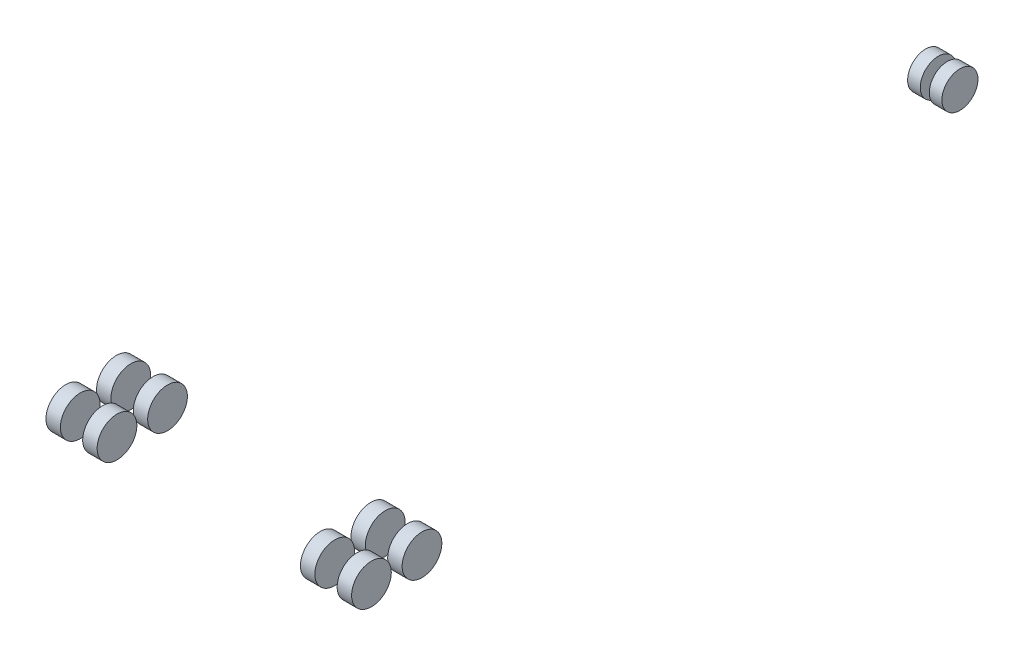
ISO-10303-21;
HEADER;
FILE_DESCRIPTION(('STEP AP214'),'2;1');
FILE_NAME('part.step','',(''),(''),'','','');
FILE_SCHEMA(('AUTOMOTIVE_DESIGN { 1 0 10303 214 1 1 1 1 }'));
ENDSEC;
DATA;
#1=APPLICATION_CONTEXT('core data for automotive mechanical design processes');
#2=APPLICATION_PROTOCOL_DEFINITION('international standard','automotive_design',2000,#1);
#3=PRODUCT_CONTEXT('',#1,'mechanical');
#4=PRODUCT('Part','Part','',(#3));
#5=PRODUCT_RELATED_PRODUCT_CATEGORY('part','',(#4));
#6=PRODUCT_DEFINITION_FORMATION('','',#4);
#7=PRODUCT_DEFINITION_CONTEXT('part definition',#1,'design');
#8=PRODUCT_DEFINITION('design','',#6,#7);
#9=PRODUCT_DEFINITION_SHAPE('','',#8);
#10=(LENGTH_UNIT() NAMED_UNIT(*) SI_UNIT(.MILLI.,.METRE.));
#11=(NAMED_UNIT(*) PLANE_ANGLE_UNIT() SI_UNIT($,.RADIAN.));
#12=(NAMED_UNIT(*) SI_UNIT($,.STERADIAN.) SOLID_ANGLE_UNIT());
#13=UNCERTAINTY_MEASURE_WITH_UNIT(LENGTH_MEASURE(1.E-05),#10,'distance_accuracy_value','');
#14=(GEOMETRIC_REPRESENTATION_CONTEXT(3) GLOBAL_UNCERTAINTY_ASSIGNED_CONTEXT((#13)) GLOBAL_UNIT_ASSIGNED_CONTEXT((#10,
#11,#12)) REPRESENTATION_CONTEXT('',''));
#15=CARTESIAN_POINT('',(0.,0.,0.));
#16=DIRECTION('',(0.,0.,1.));
#17=DIRECTION('',(1.,0.,0.));
#18=AXIS2_PLACEMENT_3D('',#15,#16,#17);
#19=CARTESIAN_POINT('',(127.,508.,-17678.4));
#20=DIRECTION('',(1.,0.,0.));
#21=DIRECTION('',(0.,0.,-1.));
#22=AXIS2_PLACEMENT_3D('',#19,#20,#21);
#23=CYLINDRICAL_SURFACE('',#22,507.999999999999);
#24=CARTESIAN_POINT('',(127.,508.,-17678.4));
#25=DIRECTION('',(1.,0.,0.));
#26=DIRECTION('',(0.,0.,-1.));
#27=AXIS2_PLACEMENT_3D('',#24,#25,#26);
#28=CIRCLE('',#27,507.999999999999);
#29=CARTESIAN_POINT('',(127.,508.,-18186.4));
#30=VERTEX_POINT('',#29);
#31=EDGE_CURVE('E11',#30,#30,#28,.T.);
#32=CARTESIAN_POINT('',(482.6,508.,-17678.4));
#33=DIRECTION('',(1.,0.,0.));
#34=DIRECTION('',(0.,0.,-1.));
#35=AXIS2_PLACEMENT_3D('',#32,#33,#34);
#36=CIRCLE('',#35,507.999999999999);
#37=CARTESIAN_POINT('',(482.6,508.,-18186.4));
#38=VERTEX_POINT('',#37);
#39=EDGE_CURVE('E57',#38,#38,#36,.T.);
#40=CARTESIAN_POINT('',(127.,508.,-18186.4));
#41=CARTESIAN_POINT('',(130.704166666667,508.,-18186.4));
#42=CARTESIAN_POINT('',(134.408333333334,508.,-18186.4));
#43=CARTESIAN_POINT('',(141.816666666667,508.,-18186.4));
#44=CARTESIAN_POINT('',(145.520833333334,508.,-18186.4));
#45=CARTESIAN_POINT('',(152.929166666667,508.,-18186.4));
#46=CARTESIAN_POINT('',(156.633333333334,508.,-18186.4));
#47=CARTESIAN_POINT('',(164.041666666667,508.,-18186.4));
#48=CARTESIAN_POINT('',(167.745833333334,508.,-18186.4));
#49=CARTESIAN_POINT('',(175.154166666667,508.,-18186.4));
#50=CARTESIAN_POINT('',(178.858333333334,508.,-18186.4));
#51=CARTESIAN_POINT('',(186.266666666667,508.,-18186.4));
#52=CARTESIAN_POINT('',(189.970833333334,508.,-18186.4));
#53=CARTESIAN_POINT('',(197.379166666667,508.,-18186.4));
#54=CARTESIAN_POINT('',(201.083333333334,508.,-18186.4));
#55=CARTESIAN_POINT('',(208.491666666667,508.,-18186.4));
#56=CARTESIAN_POINT('',(212.195833333333,508.,-18186.4));
#57=CARTESIAN_POINT('',(219.604166666667,508.,-18186.4));
#58=CARTESIAN_POINT('',(223.308333333334,508.,-18186.4));
#59=CARTESIAN_POINT('',(230.716666666667,508.,-18186.4));
#60=CARTESIAN_POINT('',(234.420833333333,508.,-18186.4));
#61=CARTESIAN_POINT('',(241.829166666667,508.,-18186.4));
#62=CARTESIAN_POINT('',(245.533333333334,508.,-18186.4));
#63=CARTESIAN_POINT('',(252.941666666667,508.,-18186.4));
#64=CARTESIAN_POINT('',(256.645833333334,508.,-18186.4));
#65=CARTESIAN_POINT('',(264.054166666667,508.,-18186.4));
#66=CARTESIAN_POINT('',(267.758333333333,508.,-18186.4));
#67=CARTESIAN_POINT('',(275.166666666667,508.,-18186.4));
#68=CARTESIAN_POINT('',(278.870833333333,508.,-18186.4));
#69=CARTESIAN_POINT('',(286.279166666667,508.,-18186.4));
#70=CARTESIAN_POINT('',(289.983333333333,508.,-18186.4));
#71=CARTESIAN_POINT('',(297.391666666667,508.,-18186.4));
#72=CARTESIAN_POINT('',(301.095833333334,508.,-18186.4));
#73=CARTESIAN_POINT('',(308.504166666667,508.,-18186.4));
#74=CARTESIAN_POINT('',(312.208333333333,508.,-18186.4));
#75=CARTESIAN_POINT('',(319.616666666667,508.,-18186.4));
#76=CARTESIAN_POINT('',(323.320833333333,508.,-18186.4));
#77=CARTESIAN_POINT('',(330.729166666667,508.,-18186.4));
#78=CARTESIAN_POINT('',(334.433333333333,508.,-18186.4));
#79=CARTESIAN_POINT('',(341.841666666667,508.,-18186.4));
#80=CARTESIAN_POINT('',(345.545833333334,508.,-18186.4));
#81=CARTESIAN_POINT('',(352.954166666667,508.,-18186.4));
#82=CARTESIAN_POINT('',(356.658333333333,508.,-18186.4));
#83=CARTESIAN_POINT('',(364.066666666667,508.,-18186.4));
#84=CARTESIAN_POINT('',(367.770833333333,508.,-18186.4));
#85=CARTESIAN_POINT('',(375.179166666667,508.,-18186.4));
#86=CARTESIAN_POINT('',(378.883333333333,508.,-18186.4));
#87=CARTESIAN_POINT('',(386.291666666667,508.,-18186.4));
#88=CARTESIAN_POINT('',(389.995833333333,508.,-18186.4));
#89=CARTESIAN_POINT('',(397.404166666667,508.,-18186.4));
#90=CARTESIAN_POINT('',(401.108333333333,508.,-18186.4));
#91=CARTESIAN_POINT('',(408.516666666667,508.,-18186.4));
#92=CARTESIAN_POINT('',(412.220833333333,508.,-18186.4));
#93=CARTESIAN_POINT('',(419.629166666667,508.,-18186.4));
#94=CARTESIAN_POINT('',(423.333333333333,508.,-18186.4));
#95=CARTESIAN_POINT('',(430.741666666667,508.,-18186.4));
#96=CARTESIAN_POINT('',(434.445833333333,508.,-18186.4));
#97=CARTESIAN_POINT('',(441.854166666667,508.,-18186.4));
#98=CARTESIAN_POINT('',(445.558333333333,508.,-18186.4));
#99=CARTESIAN_POINT('',(452.966666666667,508.,-18186.4));
#100=CARTESIAN_POINT('',(456.670833333333,508.,-18186.4));
#101=CARTESIAN_POINT('',(464.079166666667,508.,-18186.4));
#102=CARTESIAN_POINT('',(467.783333333333,508.,-18186.4));
#103=CARTESIAN_POINT('',(475.191666666667,508.,-18186.4));
#104=CARTESIAN_POINT('',(478.895833333333,508.,-18186.4));
#105=CARTESIAN_POINT('',(482.6,508.,-18186.4));
#106=B_SPLINE_CURVE_WITH_KNOTS('',3,(#40,#41,#42,#43,#44,#45,#46,#47,#48,#49,#50,#51,#52,#53,
#54,#55,#56,#57,#58,#59,#60,#61,#62,#63,#64,#65,#66,#67,#68,#69,#70,#71,#72,#73,#74,#75,#76,#77,
#78,#79,#80,#81,#82,#83,#84,#85,#86,#87,#88,#89,#90,#91,#92,#93,#94,#95,#96,#97,#98,#99,#100,
#101,#102,#103,#104,#105),.UNSPECIFIED.,.F.,.F.,(4,2,2,2,2,2,2,2,2,2,2,2,2,2,2,2,2,2,2,2,2,2,2,
2,2,2,2,2,2,2,2,2,4),(0.,11.1125,22.225,33.3375,44.45,55.5625,66.675,77.7875,88.8999999999999,
100.0125,111.125,122.2375,133.35,144.4625,155.575,166.6875,177.8,188.9125,200.025,211.1375,
222.25,233.3625,244.475,255.5875,266.7,277.8125,288.925,300.0375,311.15,322.2625,333.375,
344.4875,355.6),.UNSPECIFIED.);
#107=EDGE_CURVE('BSEAM50',#30,#38,#106,.T.);
#108=ORIENTED_EDGE('',*,*,#31,.T.);
#109=ORIENTED_EDGE('',*,*,#39,.F.);
#110=ORIENTED_EDGE('',*,*,#107,.T.);
#111=ORIENTED_EDGE('',*,*,#107,.F.);
#112=EDGE_LOOP('',(#108,#110,#109,#111));
#113=FACE_BOUND('',#112,.T.);
#114=ADVANCED_FACE('F50',(#113),#23,.T.);
#115=CARTESIAN_POINT('',(127.,508.,-17678.4));
#116=DIRECTION('',(1.,0.,0.));
#117=DIRECTION('',(0.,0.,-1.));
#118=AXIS2_PLACEMENT_3D('',#115,#116,#117);
#119=PLANE('',#118);
#120=ORIENTED_EDGE('',*,*,#31,.F.);
#121=EDGE_LOOP('',(#120));
#122=FACE_BOUND('',#121,.T.);
#123=ADVANCED_FACE('F69',(#122),#119,.F.);
#124=CARTESIAN_POINT('',(482.6,508.,-17678.4));
#125=DIRECTION('',(1.,0.,0.));
#126=DIRECTION('',(0.,0.,-1.));
#127=AXIS2_PLACEMENT_3D('',#124,#125,#126);
#128=PLANE('',#127);
#129=ORIENTED_EDGE('',*,*,#39,.T.);
#130=EDGE_LOOP('',(#129));
#131=FACE_BOUND('',#130,.T.);
#132=ADVANCED_FACE('F66',(#131),#128,.T.);
#133=CLOSED_SHELL('',(#114,#123,#132));
#134=MANIFOLD_SOLID_BREP('B2',#133);
#135=CARTESIAN_POINT('',(-482.6,508.,-17678.4));
#136=DIRECTION('',(1.,0.,0.));
#137=DIRECTION('',(0.,0.,-1.));
#138=AXIS2_PLACEMENT_3D('',#135,#136,#137);
#139=CYLINDRICAL_SURFACE('',#138,507.999999999999);
#140=CARTESIAN_POINT('',(-482.6,508.,-17678.4));
#141=DIRECTION('',(1.,0.,0.));
#142=DIRECTION('',(0.,0.,-1.));
#143=AXIS2_PLACEMENT_3D('',#140,#141,#142);
#144=CIRCLE('',#143,507.999999999999);
#145=CARTESIAN_POINT('',(-482.6,508.,-18186.4));
#146=VERTEX_POINT('',#145);
#147=EDGE_CURVE('E49',#146,#146,#144,.T.);
#148=CARTESIAN_POINT('',(-127.,508.,-17678.4));
#149=DIRECTION('',(1.,0.,0.));
#150=DIRECTION('',(0.,0.,-1.));
#151=AXIS2_PLACEMENT_3D('',#148,#149,#150);
#152=CIRCLE('',#151,507.999999999999);
#153=CARTESIAN_POINT('',(-127.,508.,-18186.4));
#154=VERTEX_POINT('',#153);
#155=EDGE_CURVE('E110',#154,#154,#152,.T.);
#156=CARTESIAN_POINT('',(-482.6,508.,-18186.4));
#157=CARTESIAN_POINT('',(-478.895833333334,508.,-18186.4));
#158=CARTESIAN_POINT('',(-475.191666666667,508.,-18186.4));
#159=CARTESIAN_POINT('',(-467.783333333333,508.,-18186.4));
#160=CARTESIAN_POINT('',(-464.079166666667,508.,-18186.4));
#161=CARTESIAN_POINT('',(-456.670833333334,508.,-18186.4));
#162=CARTESIAN_POINT('',(-452.966666666667,508.,-18186.4));
#163=CARTESIAN_POINT('',(-445.558333333334,508.,-18186.4));
#164=CARTESIAN_POINT('',(-441.854166666667,508.,-18186.4));
#165=CARTESIAN_POINT('',(-434.445833333333,508.,-18186.4));
#166=CARTESIAN_POINT('',(-430.741666666667,508.,-18186.4));
#167=CARTESIAN_POINT('',(-423.333333333333,508.,-18186.4));
#168=CARTESIAN_POINT('',(-419.629166666667,508.,-18186.4));
#169=CARTESIAN_POINT('',(-412.220833333334,508.,-18186.4));
#170=CARTESIAN_POINT('',(-408.516666666667,508.,-18186.4));
#171=CARTESIAN_POINT('',(-401.108333333334,508.,-18186.4));
#172=CARTESIAN_POINT('',(-397.404166666667,508.,-18186.4));
#173=CARTESIAN_POINT('',(-389.995833333334,508.,-18186.4));
#174=CARTESIAN_POINT('',(-386.291666666667,508.,-18186.4));
#175=CARTESIAN_POINT('',(-378.883333333333,508.,-18186.4));
#176=CARTESIAN_POINT('',(-375.179166666667,508.,-18186.4));
#177=CARTESIAN_POINT('',(-367.770833333334,508.,-18186.4));
#178=CARTESIAN_POINT('',(-364.066666666667,508.,-18186.4));
#179=CARTESIAN_POINT('',(-356.658333333334,508.,-18186.4));
#180=CARTESIAN_POINT('',(-352.954166666667,508.,-18186.4));
#181=CARTESIAN_POINT('',(-345.545833333334,508.,-18186.4));
#182=CARTESIAN_POINT('',(-341.841666666667,508.,-18186.4));
#183=CARTESIAN_POINT('',(-334.433333333334,508.,-18186.4));
#184=CARTESIAN_POINT('',(-330.729166666667,508.,-18186.4));
#185=CARTESIAN_POINT('',(-323.320833333334,508.,-18186.4));
#186=CARTESIAN_POINT('',(-319.616666666667,508.,-18186.4));
#187=CARTESIAN_POINT('',(-312.208333333334,508.,-18186.4));
#188=CARTESIAN_POINT('',(-308.504166666667,508.,-18186.4));
#189=CARTESIAN_POINT('',(-301.095833333334,508.,-18186.4));
#190=CARTESIAN_POINT('',(-297.391666666667,508.,-18186.4));
#191=CARTESIAN_POINT('',(-289.983333333334,508.,-18186.4));
#192=CARTESIAN_POINT('',(-286.279166666667,508.,-18186.4));
#193=CARTESIAN_POINT('',(-278.870833333334,508.,-18186.4));
#194=CARTESIAN_POINT('',(-275.166666666667,508.,-18186.4));
#195=CARTESIAN_POINT('',(-267.758333333334,508.,-18186.4));
#196=CARTESIAN_POINT('',(-264.054166666667,508.,-18186.4));
#197=CARTESIAN_POINT('',(-256.645833333334,508.,-18186.4));
#198=CARTESIAN_POINT('',(-252.941666666667,508.,-18186.4));
#199=CARTESIAN_POINT('',(-245.533333333334,508.,-18186.4));
#200=CARTESIAN_POINT('',(-241.829166666667,508.,-18186.4));
#201=CARTESIAN_POINT('',(-234.420833333334,508.,-18186.4));
#202=CARTESIAN_POINT('',(-230.716666666667,508.,-18186.4));
#203=CARTESIAN_POINT('',(-223.308333333334,508.,-18186.4));
#204=CARTESIAN_POINT('',(-219.604166666667,508.,-18186.4));
#205=CARTESIAN_POINT('',(-212.195833333334,508.,-18186.4));
#206=CARTESIAN_POINT('',(-208.491666666667,508.,-18186.4));
#207=CARTESIAN_POINT('',(-201.083333333334,508.,-18186.4));
#208=CARTESIAN_POINT('',(-197.379166666667,508.,-18186.4));
#209=CARTESIAN_POINT('',(-189.970833333334,508.,-18186.4));
#210=CARTESIAN_POINT('',(-186.266666666667,508.,-18186.4));
#211=CARTESIAN_POINT('',(-178.858333333334,508.,-18186.4));
#212=CARTESIAN_POINT('',(-175.154166666667,508.,-18186.4));
#213=CARTESIAN_POINT('',(-167.745833333334,508.,-18186.4));
#214=CARTESIAN_POINT('',(-164.041666666667,508.,-18186.4));
#215=CARTESIAN_POINT('',(-156.633333333334,508.,-18186.4));
#216=CARTESIAN_POINT('',(-152.929166666667,508.,-18186.4));
#217=CARTESIAN_POINT('',(-145.520833333334,508.,-18186.4));
#218=CARTESIAN_POINT('',(-141.816666666667,508.,-18186.4));
#219=CARTESIAN_POINT('',(-134.408333333334,508.,-18186.4));
#220=CARTESIAN_POINT('',(-130.704166666667,508.,-18186.4));
#221=CARTESIAN_POINT('',(-127.,508.,-18186.4));
#222=B_SPLINE_CURVE_WITH_KNOTS('',3,(#156,#157,#158,#159,#160,#161,#162,#163,#164,#165,#166,
#167,#168,#169,#170,#171,#172,#173,#174,#175,#176,#177,#178,#179,#180,#181,#182,#183,#184,#185,
#186,#187,#188,#189,#190,#191,#192,#193,#194,#195,#196,#197,#198,#199,#200,#201,#202,#203,#204,
#205,#206,#207,#208,#209,#210,#211,#212,#213,#214,#215,#216,#217,#218,#219,#220,#221),
.UNSPECIFIED.,.F.,.F.,(4,2,2,2,2,2,2,2,2,2,2,2,2,2,2,2,2,2,2,2,2,2,2,2,2,2,2,2,2,2,2,2,4),(0.,
11.1125,22.225,33.3375,44.45,55.5625,66.675,77.7875,88.9,100.0125,111.125,122.2375,133.35,
144.4625,155.575,166.6875,177.8,188.9125,200.025,211.1375,222.25,233.3625,244.475,255.5875,
266.7,277.8125,288.925,300.0375,311.15,322.2625,333.375,344.4875,355.6),.UNSPECIFIED.);
#223=EDGE_CURVE('BSEAM103',#146,#154,#222,.T.);
#224=ORIENTED_EDGE('',*,*,#147,.T.);
#225=ORIENTED_EDGE('',*,*,#155,.F.);
#226=ORIENTED_EDGE('',*,*,#223,.T.);
#227=ORIENTED_EDGE('',*,*,#223,.F.);
#228=EDGE_LOOP('',(#224,#226,#225,#227));
#229=FACE_BOUND('',#228,.T.);
#230=ADVANCED_FACE('F103',(#229),#139,.T.);
#231=CARTESIAN_POINT('',(-482.6,508.,-17678.4));
#232=DIRECTION('',(1.,0.,0.));
#233=DIRECTION('',(0.,0.,-1.));
#234=AXIS2_PLACEMENT_3D('',#231,#232,#233);
#235=PLANE('',#234);
#236=ORIENTED_EDGE('',*,*,#147,.F.);
#237=EDGE_LOOP('',(#236));
#238=FACE_BOUND('',#237,.T.);
#239=ADVANCED_FACE('F122',(#238),#235,.F.);
#240=CARTESIAN_POINT('',(-127.,508.,-17678.4));
#241=DIRECTION('',(1.,0.,0.));
#242=DIRECTION('',(0.,0.,-1.));
#243=AXIS2_PLACEMENT_3D('',#240,#241,#242);
#244=PLANE('',#243);
#245=ORIENTED_EDGE('',*,*,#155,.T.);
#246=EDGE_LOOP('',(#245));
#247=FACE_BOUND('',#246,.T.);
#248=ADVANCED_FACE('F119',(#247),#244,.T.);
#249=CLOSED_SHELL('',(#230,#239,#248));
#250=MANIFOLD_SOLID_BREP('B6',#249);
#251=CARTESIAN_POINT('',(3894.12299207705,558.8,1278.62803887901));
#252=DIRECTION('',(1.,0.,0.));
#253=DIRECTION('',(0.,0.,-1.));
#254=AXIS2_PLACEMENT_3D('',#251,#252,#253);
#255=CYLINDRICAL_SURFACE('',#254,558.8);
#256=CARTESIAN_POINT('',(3894.12299207705,558.8,1278.62803887901));
#257=DIRECTION('',(1.,0.,0.));
#258=DIRECTION('',(0.,0.,-1.));
#259=AXIS2_PLACEMENT_3D('',#256,#257,#258);
#260=CIRCLE('',#259,558.8);
#261=CARTESIAN_POINT('',(3894.12299207705,558.8,719.82803887901));
#262=VERTEX_POINT('',#261);
#263=EDGE_CURVE('E164',#262,#262,#260,.T.);
#264=ORIENTED_EDGE('',*,*,#263,.T.);
#265=EDGE_LOOP('',(#264));
#266=FACE_BOUND('',#265,.T.);
#267=CARTESIAN_POINT('',(4300.52299207705,558.8,1278.62803887901));
#268=DIRECTION('',(1.,0.,0.));
#269=DIRECTION('',(0.,0.,-1.));
#270=AXIS2_PLACEMENT_3D('',#267,#268,#269);
#271=CIRCLE('',#270,558.8);
#272=CARTESIAN_POINT('',(4300.52299207705,558.8,719.82803887901));
#273=VERTEX_POINT('',#272);
#274=EDGE_CURVE('E102',#273,#273,#271,.T.);
#275=ORIENTED_EDGE('',*,*,#274,.F.);
#276=EDGE_LOOP('',(#275));
#277=FACE_BOUND('',#276,.T.);
#278=ADVANCED_FACE('F156',(#266,#277),#255,.T.);
#279=CARTESIAN_POINT('',(3894.12299207705,558.8,1278.62803887901));
#280=DIRECTION('',(1.,0.,0.));
#281=DIRECTION('',(0.,0.,-1.));
#282=AXIS2_PLACEMENT_3D('',#279,#280,#281);
#283=PLANE('',#282);
#284=ORIENTED_EDGE('',*,*,#263,.F.);
#285=EDGE_LOOP('',(#284));
#286=FACE_BOUND('',#285,.T.);
#287=ADVANCED_FACE('F175',(#286),#283,.F.);
#288=CARTESIAN_POINT('',(4300.52299207705,558.8,1278.62803887901));
#289=DIRECTION('',(1.,0.,0.));
#290=DIRECTION('',(0.,0.,-1.));
#291=AXIS2_PLACEMENT_3D('',#288,#289,#290);
#292=PLANE('',#291);
#293=ORIENTED_EDGE('',*,*,#274,.T.);
#294=EDGE_LOOP('',(#293));
#295=FACE_BOUND('',#294,.T.);
#296=ADVANCED_FACE('F158',(#295),#292,.T.);
#297=CLOSED_SHELL('',(#278,#287,#296));
#298=MANIFOLD_SOLID_BREP('B44',#297);
#299=CARTESIAN_POINT('',(3894.12299207705,558.8,2701.02803887901));
#300=DIRECTION('',(1.,0.,0.));
#301=DIRECTION('',(0.,0.,-1.));
#302=AXIS2_PLACEMENT_3D('',#299,#300,#301);
#303=CYLINDRICAL_SURFACE('',#302,558.8);
#304=CARTESIAN_POINT('',(3894.12299207705,558.8,2701.02803887901));
#305=DIRECTION('',(1.,0.,0.));
#306=DIRECTION('',(0.,0.,-1.));
#307=AXIS2_PLACEMENT_3D('',#304,#305,#306);
#308=CIRCLE('',#307,558.8);
#309=CARTESIAN_POINT('',(3894.12299207705,558.8,2142.22803887901));
#310=VERTEX_POINT('',#309);
#311=EDGE_CURVE('E155',#310,#310,#308,.T.);
#312=ORIENTED_EDGE('',*,*,#311,.T.);
#313=EDGE_LOOP('',(#312));
#314=FACE_BOUND('',#313,.T.);
#315=CARTESIAN_POINT('',(4300.52299207705,558.8,2701.02803887901));
#316=DIRECTION('',(1.,0.,0.));
#317=DIRECTION('',(0.,0.,-1.));
#318=AXIS2_PLACEMENT_3D('',#315,#316,#317);
#319=CIRCLE('',#318,558.8);
#320=CARTESIAN_POINT('',(4300.52299207705,558.8,2142.22803887901));
#321=VERTEX_POINT('',#320);
#322=EDGE_CURVE('E216',#321,#321,#319,.T.);
#323=ORIENTED_EDGE('',*,*,#322,.F.);
#324=EDGE_LOOP('',(#323));
#325=FACE_BOUND('',#324,.T.);
#326=ADVANCED_FACE('F209',(#314,#325),#303,.T.);
#327=CARTESIAN_POINT('',(3894.12299207705,558.8,2701.02803887901));
#328=DIRECTION('',(1.,0.,0.));
#329=DIRECTION('',(0.,0.,-1.));
#330=AXIS2_PLACEMENT_3D('',#327,#328,#329);
#331=PLANE('',#330);
#332=ORIENTED_EDGE('',*,*,#311,.F.);
#333=EDGE_LOOP('',(#332));
#334=FACE_BOUND('',#333,.T.);
#335=ADVANCED_FACE('F228',(#334),#331,.F.);
#336=CARTESIAN_POINT('',(4300.52299207705,558.8,2701.02803887901));
#337=DIRECTION('',(1.,0.,0.));
#338=DIRECTION('',(0.,0.,-1.));
#339=AXIS2_PLACEMENT_3D('',#336,#337,#338);
#340=PLANE('',#339);
#341=ORIENTED_EDGE('',*,*,#322,.T.);
#342=EDGE_LOOP('',(#341));
#343=FACE_BOUND('',#342,.T.);
#344=ADVANCED_FACE('F225',(#343),#340,.T.);
#345=CLOSED_SHELL('',(#326,#335,#344));
#346=MANIFOLD_SOLID_BREP('B97',#345);
#347=CARTESIAN_POINT('',(2860.68890024233,558.8,2701.02803887901));
#348=DIRECTION('',(1.,0.,0.));
#349=DIRECTION('',(0.,0.,-1.));
#350=AXIS2_PLACEMENT_3D('',#347,#348,#349);
#351=CYLINDRICAL_SURFACE('',#350,558.8);
#352=CARTESIAN_POINT('',(2860.68890024233,558.8,2701.02803887901));
#353=DIRECTION('',(1.,0.,0.));
#354=DIRECTION('',(0.,0.,-1.));
#355=AXIS2_PLACEMENT_3D('',#352,#353,#354);
#356=CIRCLE('',#355,558.8);
#357=CARTESIAN_POINT('',(2860.68890024233,558.8,2142.22803887901));
#358=VERTEX_POINT('',#357);
#359=EDGE_CURVE('E270',#358,#358,#356,.T.);
#360=ORIENTED_EDGE('',*,*,#359,.T.);
#361=EDGE_LOOP('',(#360));
#362=FACE_BOUND('',#361,.T.);
#363=CARTESIAN_POINT('',(3267.08890024233,558.8,2701.02803887901));
#364=DIRECTION('',(1.,0.,0.));
#365=DIRECTION('',(0.,0.,-1.));
#366=AXIS2_PLACEMENT_3D('',#363,#364,#365);
#367=CIRCLE('',#366,558.8);
#368=CARTESIAN_POINT('',(3267.08890024233,558.8,2142.22803887901));
#369=VERTEX_POINT('',#368);
#370=EDGE_CURVE('E208',#369,#369,#367,.T.);
#371=ORIENTED_EDGE('',*,*,#370,.F.);
#372=EDGE_LOOP('',(#371));
#373=FACE_BOUND('',#372,.T.);
#374=ADVANCED_FACE('F262',(#362,#373),#351,.T.);
#375=CARTESIAN_POINT('',(2860.68890024233,558.8,2701.02803887901));
#376=DIRECTION('',(1.,0.,0.));
#377=DIRECTION('',(0.,0.,-1.));
#378=AXIS2_PLACEMENT_3D('',#375,#376,#377);
#379=PLANE('',#378);
#380=ORIENTED_EDGE('',*,*,#359,.F.);
#381=EDGE_LOOP('',(#380));
#382=FACE_BOUND('',#381,.T.);
#383=ADVANCED_FACE('F281',(#382),#379,.F.);
#384=CARTESIAN_POINT('',(3267.08890024233,558.8,2701.02803887901));
#385=DIRECTION('',(1.,0.,0.));
#386=DIRECTION('',(0.,0.,-1.));
#387=AXIS2_PLACEMENT_3D('',#384,#385,#386);
#388=PLANE('',#387);
#389=ORIENTED_EDGE('',*,*,#370,.T.);
#390=EDGE_LOOP('',(#389));
#391=FACE_BOUND('',#390,.T.);
#392=ADVANCED_FACE('F264',(#391),#388,.T.);
#393=CLOSED_SHELL('',(#374,#383,#392));
#394=MANIFOLD_SOLID_BREP('B150',#393);
#395=CARTESIAN_POINT('',(2860.68890024233,558.8,1278.62803887901));
#396=DIRECTION('',(1.,0.,0.));
#397=DIRECTION('',(0.,0.,-1.));
#398=AXIS2_PLACEMENT_3D('',#395,#396,#397);
#399=CYLINDRICAL_SURFACE('',#398,558.8);
#400=CARTESIAN_POINT('',(2860.68890024233,558.8,1278.62803887901));
#401=DIRECTION('',(1.,0.,0.));
#402=DIRECTION('',(0.,0.,-1.));
#403=AXIS2_PLACEMENT_3D('',#400,#401,#402);
#404=CIRCLE('',#403,558.8);
#405=CARTESIAN_POINT('',(2860.68890024233,558.8,719.82803887901));
#406=VERTEX_POINT('',#405);
#407=EDGE_CURVE('E261',#406,#406,#404,.T.);
#408=ORIENTED_EDGE('',*,*,#407,.T.);
#409=EDGE_LOOP('',(#408));
#410=FACE_BOUND('',#409,.T.);
#411=CARTESIAN_POINT('',(3267.08890024233,558.8,1278.62803887901));
#412=DIRECTION('',(1.,0.,0.));
#413=DIRECTION('',(0.,0.,-1.));
#414=AXIS2_PLACEMENT_3D('',#411,#412,#413);
#415=CIRCLE('',#414,558.8);
#416=CARTESIAN_POINT('',(3267.08890024233,558.8,719.82803887901));
#417=VERTEX_POINT('',#416);
#418=EDGE_CURVE('E322',#417,#417,#415,.T.);
#419=ORIENTED_EDGE('',*,*,#418,.F.);
#420=EDGE_LOOP('',(#419));
#421=FACE_BOUND('',#420,.T.);
#422=ADVANCED_FACE('F315',(#410,#421),#399,.T.);
#423=CARTESIAN_POINT('',(2860.68890024233,558.8,1278.62803887901));
#424=DIRECTION('',(1.,0.,0.));
#425=DIRECTION('',(0.,0.,-1.));
#426=AXIS2_PLACEMENT_3D('',#423,#424,#425);
#427=PLANE('',#426);
#428=ORIENTED_EDGE('',*,*,#407,.F.);
#429=EDGE_LOOP('',(#428));
#430=FACE_BOUND('',#429,.T.);
#431=ADVANCED_FACE('F334',(#430),#427,.F.);
#432=CARTESIAN_POINT('',(3267.08890024233,558.8,1278.62803887901));
#433=DIRECTION('',(1.,0.,0.));
#434=DIRECTION('',(0.,0.,-1.));
#435=AXIS2_PLACEMENT_3D('',#432,#433,#434);
#436=PLANE('',#435);
#437=ORIENTED_EDGE('',*,*,#418,.T.);
#438=EDGE_LOOP('',(#437));
#439=FACE_BOUND('',#438,.T.);
#440=ADVANCED_FACE('F331',(#439),#436,.T.);
#441=CLOSED_SHELL('',(#422,#431,#440));
#442=MANIFOLD_SOLID_BREP('B203',#441);
#443=CARTESIAN_POINT('',(-4300.52299207705,558.8,1278.62803887901));
#444=DIRECTION('',(1.,0.,0.));
#445=DIRECTION('',(0.,0.,-1.));
#446=AXIS2_PLACEMENT_3D('',#443,#444,#445);
#447=CYLINDRICAL_SURFACE('',#446,558.8);
#448=CARTESIAN_POINT('',(-4300.52299207705,558.8,1278.62803887901));
#449=DIRECTION('',(1.,0.,0.));
#450=DIRECTION('',(0.,0.,-1.));
#451=AXIS2_PLACEMENT_3D('',#448,#449,#450);
#452=CIRCLE('',#451,558.8);
#453=CARTESIAN_POINT('',(-4300.52299207705,558.8,719.82803887901));
#454=VERTEX_POINT('',#453);
#455=EDGE_CURVE('E376',#454,#454,#452,.T.);
#456=ORIENTED_EDGE('',*,*,#455,.T.);
#457=EDGE_LOOP('',(#456));
#458=FACE_BOUND('',#457,.T.);
#459=CARTESIAN_POINT('',(-3894.12299207705,558.8,1278.62803887901));
#460=DIRECTION('',(1.,0.,0.));
#461=DIRECTION('',(0.,0.,-1.));
#462=AXIS2_PLACEMENT_3D('',#459,#460,#461);
#463=CIRCLE('',#462,558.8);
#464=CARTESIAN_POINT('',(-3894.12299207705,558.8,719.82803887901));
#465=VERTEX_POINT('',#464);
#466=EDGE_CURVE('E314',#465,#465,#463,.T.);
#467=ORIENTED_EDGE('',*,*,#466,.F.);
#468=EDGE_LOOP('',(#467));
#469=FACE_BOUND('',#468,.T.);
#470=ADVANCED_FACE('F368',(#458,#469),#447,.T.);
#471=CARTESIAN_POINT('',(-4300.52299207705,558.8,1278.62803887901));
#472=DIRECTION('',(1.,0.,0.));
#473=DIRECTION('',(0.,0.,-1.));
#474=AXIS2_PLACEMENT_3D('',#471,#472,#473);
#475=PLANE('',#474);
#476=ORIENTED_EDGE('',*,*,#455,.F.);
#477=EDGE_LOOP('',(#476));
#478=FACE_BOUND('',#477,.T.);
#479=ADVANCED_FACE('F387',(#478),#475,.F.);
#480=CARTESIAN_POINT('',(-3894.12299207705,558.8,1278.62803887901));
#481=DIRECTION('',(1.,0.,0.));
#482=DIRECTION('',(0.,0.,-1.));
#483=AXIS2_PLACEMENT_3D('',#480,#481,#482);
#484=PLANE('',#483);
#485=ORIENTED_EDGE('',*,*,#466,.T.);
#486=EDGE_LOOP('',(#485));
#487=FACE_BOUND('',#486,.T.);
#488=ADVANCED_FACE('F370',(#487),#484,.T.);
#489=CLOSED_SHELL('',(#470,#479,#488));
#490=MANIFOLD_SOLID_BREP('B256',#489);
#491=CARTESIAN_POINT('',(-4300.52299207705,558.8,2701.02803887901));
#492=DIRECTION('',(1.,0.,0.));
#493=DIRECTION('',(0.,0.,-1.));
#494=AXIS2_PLACEMENT_3D('',#491,#492,#493);
#495=CYLINDRICAL_SURFACE('',#494,558.8);
#496=CARTESIAN_POINT('',(-4300.52299207705,558.8,2701.02803887901));
#497=DIRECTION('',(1.,0.,0.));
#498=DIRECTION('',(0.,0.,-1.));
#499=AXIS2_PLACEMENT_3D('',#496,#497,#498);
#500=CIRCLE('',#499,558.8);
#501=CARTESIAN_POINT('',(-4300.52299207705,558.8,2142.22803887901));
#502=VERTEX_POINT('',#501);
#503=EDGE_CURVE('E367',#502,#502,#500,.T.);
#504=ORIENTED_EDGE('',*,*,#503,.T.);
#505=EDGE_LOOP('',(#504));
#506=FACE_BOUND('',#505,.T.);
#507=CARTESIAN_POINT('',(-3894.12299207705,558.8,2701.02803887901));
#508=DIRECTION('',(1.,0.,0.));
#509=DIRECTION('',(0.,0.,-1.));
#510=AXIS2_PLACEMENT_3D('',#507,#508,#509);
#511=CIRCLE('',#510,558.8);
#512=CARTESIAN_POINT('',(-3894.12299207705,558.8,2142.22803887901));
#513=VERTEX_POINT('',#512);
#514=EDGE_CURVE('E428',#513,#513,#511,.T.);
#515=ORIENTED_EDGE('',*,*,#514,.F.);
#516=EDGE_LOOP('',(#515));
#517=FACE_BOUND('',#516,.T.);
#518=ADVANCED_FACE('F421',(#506,#517),#495,.T.);
#519=CARTESIAN_POINT('',(-4300.52299207705,558.8,2701.02803887901));
#520=DIRECTION('',(1.,0.,0.));
#521=DIRECTION('',(0.,0.,-1.));
#522=AXIS2_PLACEMENT_3D('',#519,#520,#521);
#523=PLANE('',#522);
#524=ORIENTED_EDGE('',*,*,#503,.F.);
#525=EDGE_LOOP('',(#524));
#526=FACE_BOUND('',#525,.T.);
#527=ADVANCED_FACE('F440',(#526),#523,.F.);
#528=CARTESIAN_POINT('',(-3894.12299207705,558.8,2701.02803887901));
#529=DIRECTION('',(1.,0.,0.));
#530=DIRECTION('',(0.,0.,-1.));
#531=AXIS2_PLACEMENT_3D('',#528,#529,#530);
#532=PLANE('',#531);
#533=ORIENTED_EDGE('',*,*,#514,.T.);
#534=EDGE_LOOP('',(#533));
#535=FACE_BOUND('',#534,.T.);
#536=ADVANCED_FACE('F437',(#535),#532,.T.);
#537=CLOSED_SHELL('',(#518,#527,#536));
#538=MANIFOLD_SOLID_BREP('B309',#537);
#539=CARTESIAN_POINT('',(-3267.08890024227,558.8,1278.62803887901));
#540=DIRECTION('',(1.,0.,0.));
#541=DIRECTION('',(0.,0.,-1.));
#542=AXIS2_PLACEMENT_3D('',#539,#540,#541);
#543=CYLINDRICAL_SURFACE('',#542,558.8);
#544=CARTESIAN_POINT('',(-3267.08890024227,558.8,1278.62803887901));
#545=DIRECTION('',(1.,0.,0.));
#546=DIRECTION('',(0.,0.,-1.));
#547=AXIS2_PLACEMENT_3D('',#544,#545,#546);
#548=CIRCLE('',#547,558.8);
#549=CARTESIAN_POINT('',(-3267.08890024227,558.8,719.82803887901));
#550=VERTEX_POINT('',#549);
#551=EDGE_CURVE('E481',#550,#550,#548,.T.);
#552=ORIENTED_EDGE('',*,*,#551,.T.);
#553=EDGE_LOOP('',(#552));
#554=FACE_BOUND('',#553,.T.);
#555=CARTESIAN_POINT('',(-2860.68890024227,558.8,1278.62803887901));
#556=DIRECTION('',(1.,0.,0.));
#557=DIRECTION('',(0.,0.,-1.));
#558=AXIS2_PLACEMENT_3D('',#555,#556,#557);
#559=CIRCLE('',#558,558.8);
#560=CARTESIAN_POINT('',(-2860.68890024227,558.8,719.82803887901));
#561=VERTEX_POINT('',#560);
#562=EDGE_CURVE('E420',#561,#561,#559,.T.);
#563=ORIENTED_EDGE('',*,*,#562,.F.);
#564=EDGE_LOOP('',(#563));
#565=FACE_BOUND('',#564,.T.);
#566=ADVANCED_FACE('F473',(#554,#565),#543,.T.);
#567=CARTESIAN_POINT('',(-3267.08890024227,558.8,1278.62803887901));
#568=DIRECTION('',(1.,0.,0.));
#569=DIRECTION('',(0.,0.,-1.));
#570=AXIS2_PLACEMENT_3D('',#567,#568,#569);
#571=PLANE('',#570);
#572=ORIENTED_EDGE('',*,*,#551,.F.);
#573=EDGE_LOOP('',(#572));
#574=FACE_BOUND('',#573,.T.);
#575=ADVANCED_FACE('F492',(#574),#571,.F.);
#576=CARTESIAN_POINT('',(-2860.68890024227,558.8,1278.62803887901));
#577=DIRECTION('',(1.,0.,0.));
#578=DIRECTION('',(0.,0.,-1.));
#579=AXIS2_PLACEMENT_3D('',#576,#577,#578);
#580=PLANE('',#579);
#581=ORIENTED_EDGE('',*,*,#562,.T.);
#582=EDGE_LOOP('',(#581));
#583=FACE_BOUND('',#582,.T.);
#584=ADVANCED_FACE('F475',(#583),#580,.T.);
#585=CLOSED_SHELL('',(#566,#575,#584));
#586=MANIFOLD_SOLID_BREP('B362',#585);
#587=CARTESIAN_POINT('',(-3267.08890024227,558.8,2701.02803887901));
#588=DIRECTION('',(1.,0.,0.));
#589=DIRECTION('',(0.,0.,-1.));
#590=AXIS2_PLACEMENT_3D('',#587,#588,#589);
#591=CYLINDRICAL_SURFACE('',#590,558.8);
#592=CARTESIAN_POINT('',(-3267.08890024227,558.8,2701.02803887901));
#593=DIRECTION('',(1.,0.,0.));
#594=DIRECTION('',(0.,0.,-1.));
#595=AXIS2_PLACEMENT_3D('',#592,#593,#594);
#596=CIRCLE('',#595,558.8);
#597=CARTESIAN_POINT('',(-3267.08890024227,558.8,2142.22803887901));
#598=VERTEX_POINT('',#597);
#599=EDGE_CURVE('E472',#598,#598,#596,.T.);
#600=ORIENTED_EDGE('',*,*,#599,.T.);
#601=EDGE_LOOP('',(#600));
#602=FACE_BOUND('',#601,.T.);
#603=CARTESIAN_POINT('',(-2860.68890024227,558.8,2701.02803887901));
#604=DIRECTION('',(1.,0.,0.));
#605=DIRECTION('',(0.,0.,-1.));
#606=AXIS2_PLACEMENT_3D('',#603,#604,#605);
#607=CIRCLE('',#606,558.8);
#608=CARTESIAN_POINT('',(-2860.68890024227,558.8,2142.22803887901));
#609=VERTEX_POINT('',#608);
#610=EDGE_CURVE('E525',#609,#609,#607,.T.);
#611=ORIENTED_EDGE('',*,*,#610,.F.);
#612=EDGE_LOOP('',(#611));
#613=FACE_BOUND('',#612,.T.);
#614=ADVANCED_FACE('F518',(#602,#613),#591,.T.);
#615=CARTESIAN_POINT('',(-3267.08890024227,558.8,2701.02803887901));
#616=DIRECTION('',(1.,0.,0.));
#617=DIRECTION('',(0.,0.,-1.));
#618=AXIS2_PLACEMENT_3D('',#615,#616,#617);
#619=PLANE('',#618);
#620=ORIENTED_EDGE('',*,*,#599,.F.);
#621=EDGE_LOOP('',(#620));
#622=FACE_BOUND('',#621,.T.);
#623=ADVANCED_FACE('F537',(#622),#619,.F.);
#624=CARTESIAN_POINT('',(-2860.68890024227,558.8,2701.02803887901));
#625=DIRECTION('',(1.,0.,0.));
#626=DIRECTION('',(0.,0.,-1.));
#627=AXIS2_PLACEMENT_3D('',#624,#625,#626);
#628=PLANE('',#627);
#629=ORIENTED_EDGE('',*,*,#610,.T.);
#630=EDGE_LOOP('',(#629));
#631=FACE_BOUND('',#630,.T.);
#632=ADVANCED_FACE('F534',(#631),#628,.T.);
#633=CLOSED_SHELL('',(#614,#623,#632));
#634=MANIFOLD_SOLID_BREP('B415',#633);
#635=ADVANCED_BREP_SHAPE_REPRESENTATION('',(#18,#134,#250,#298,#346,#394,#442,#490,#538,#586,
#634),#14);
#636=SHAPE_DEFINITION_REPRESENTATION(#9,#635);
ENDSEC;
END-ISO-10303-21;
